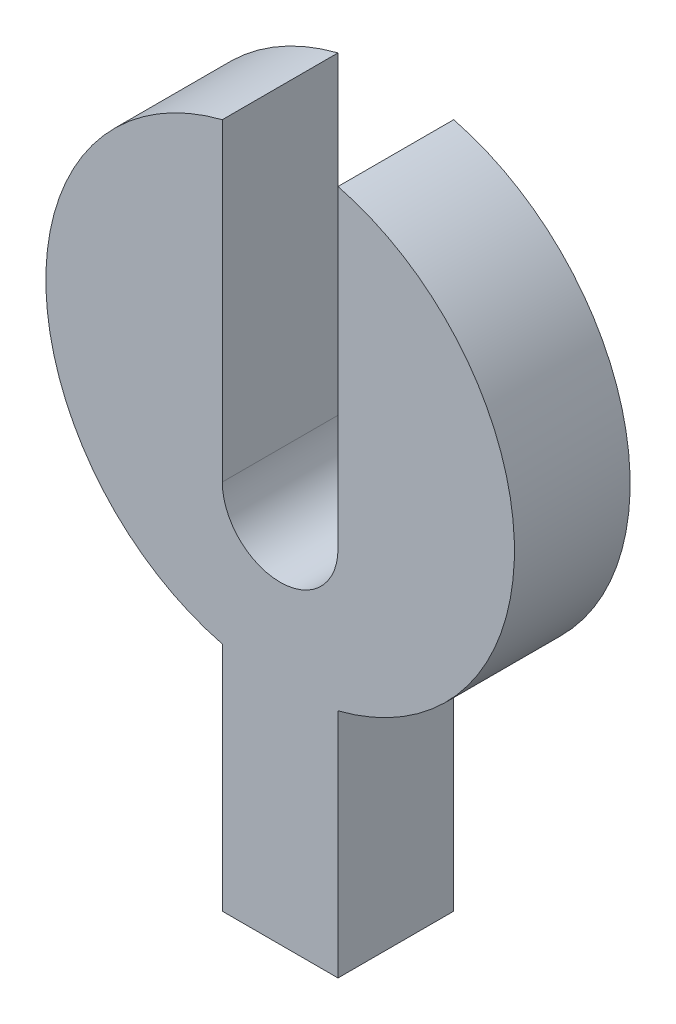
ISO-10303-21;
HEADER;
FILE_DESCRIPTION(('STEP AP214'),'2;1');
FILE_NAME('part.step','',(''),(''),'','','');
FILE_SCHEMA(('AUTOMOTIVE_DESIGN { 1 0 10303 214 1 1 1 1 }'));
ENDSEC;
DATA;
#1=APPLICATION_CONTEXT('core data for automotive mechanical design processes');
#2=APPLICATION_PROTOCOL_DEFINITION('international standard','automotive_design',2000,#1);
#3=PRODUCT_CONTEXT('',#1,'mechanical');
#4=PRODUCT('Part','Part','',(#3));
#5=PRODUCT_RELATED_PRODUCT_CATEGORY('part','',(#4));
#6=PRODUCT_DEFINITION_FORMATION('','',#4);
#7=PRODUCT_DEFINITION_CONTEXT('part definition',#1,'design');
#8=PRODUCT_DEFINITION('design','',#6,#7);
#9=PRODUCT_DEFINITION_SHAPE('','',#8);
#10=(LENGTH_UNIT() NAMED_UNIT(*) SI_UNIT(.MILLI.,.METRE.));
#11=(NAMED_UNIT(*) PLANE_ANGLE_UNIT() SI_UNIT($,.RADIAN.));
#12=(NAMED_UNIT(*) SI_UNIT($,.STERADIAN.) SOLID_ANGLE_UNIT());
#13=UNCERTAINTY_MEASURE_WITH_UNIT(LENGTH_MEASURE(1.E-05),#10,'distance_accuracy_value','');
#14=(GEOMETRIC_REPRESENTATION_CONTEXT(3) GLOBAL_UNCERTAINTY_ASSIGNED_CONTEXT((#13)) GLOBAL_UNIT_ASSIGNED_CONTEXT((#10,
#11,#12)) REPRESENTATION_CONTEXT('',''));
#15=CARTESIAN_POINT('',(0.,0.,0.));
#16=DIRECTION('',(0.,0.,1.));
#17=DIRECTION('',(1.,0.,0.));
#18=AXIS2_PLACEMENT_3D('',#15,#16,#17);
#19=CARTESIAN_POINT('',(0.,-3.,4.));
#20=DIRECTION('',(0.,0.,-1.));
#21=DIRECTION('',(-1.,0.,0.));
#22=AXIS2_PLACEMENT_3D('',#19,#20,#21);
#23=CYLINDRICAL_SURFACE('',#22,2.);
#24=CARTESIAN_POINT('',(0.,-3.,0.));
#25=DIRECTION('',(0.,0.,1.));
#26=DIRECTION('',(1.,0.,0.));
#27=AXIS2_PLACEMENT_3D('',#24,#25,#26);
#28=CIRCLE('',#27,2.);
#29=CARTESIAN_POINT('',(-2.,-3.,0.));
#30=VERTEX_POINT('',#29);
#31=CARTESIAN_POINT('',(2.,-3.,0.));
#32=VERTEX_POINT('',#31);
#33=EDGE_CURVE('E166',#30,#32,#28,.T.);
#34=ORIENTED_EDGE('',*,*,#33,.F.);
#35=DIRECTION('',(0.,0.,-1.));
#36=VECTOR('',#35,1.);
#37=CARTESIAN_POINT('',(-2.,-3.,4.));
#38=LINE('',#37,#36);
#39=CARTESIAN_POINT('',(-2.,-3.,4.));
#40=VERTEX_POINT('',#39);
#41=EDGE_CURVE('E11',#40,#30,#38,.T.);
#42=ORIENTED_EDGE('',*,*,#41,.F.);
#43=CARTESIAN_POINT('',(0.,-3.,4.));
#44=DIRECTION('',(0.,0.,1.));
#45=DIRECTION('',(1.,0.,0.));
#46=AXIS2_PLACEMENT_3D('',#43,#44,#45);
#47=CIRCLE('',#46,2.);
#48=CARTESIAN_POINT('',(2.,-3.,4.));
#49=VERTEX_POINT('',#48);
#50=EDGE_CURVE('E138',#40,#49,#47,.T.);
#51=ORIENTED_EDGE('',*,*,#50,.T.);
#52=DIRECTION('',(0.,0.,-1.));
#53=VECTOR('',#52,1.);
#54=CARTESIAN_POINT('',(2.,-3.,4.));
#55=LINE('',#54,#53);
#56=EDGE_CURVE('E89',#49,#32,#55,.T.);
#57=ORIENTED_EDGE('',*,*,#56,.T.);
#58=EDGE_LOOP('',(#34,#42,#51,#57));
#59=FACE_BOUND('',#58,.T.);
#60=ADVANCED_FACE('F39',(#59),#23,.F.);
#61=CARTESIAN_POINT('',(-2.,0.,4.));
#62=DIRECTION('',(1.,0.,0.));
#63=DIRECTION('',(0.,1.,0.));
#64=AXIS2_PLACEMENT_3D('',#61,#62,#63);
#65=PLANE('',#64);
#66=DIRECTION('',(0.,-1.,0.));
#67=VECTOR('',#66,1.);
#68=CARTESIAN_POINT('',(-2.,0.,0.));
#69=LINE('',#68,#67);
#70=CARTESIAN_POINT('',(-2.,7.84920378127616,0.));
#71=VERTEX_POINT('',#70);
#72=EDGE_CURVE('E163',#71,#30,#69,.T.);
#73=ORIENTED_EDGE('',*,*,#72,.F.);
#74=DIRECTION('',(0.,0.,-1.));
#75=VECTOR('',#74,1.);
#76=CARTESIAN_POINT('',(-2.,7.84920378127616,4.));
#77=LINE('',#76,#75);
#78=CARTESIAN_POINT('',(-2.,7.84920378127616,4.));
#79=VERTEX_POINT('',#78);
#80=EDGE_CURVE('E47',#79,#71,#77,.T.);
#81=ORIENTED_EDGE('',*,*,#80,.F.);
#82=DIRECTION('',(0.,-1.,0.));
#83=VECTOR('',#82,1.);
#84=CARTESIAN_POINT('',(-2.,0.,4.));
#85=LINE('',#84,#83);
#86=EDGE_CURVE('E134',#79,#40,#85,.T.);
#87=ORIENTED_EDGE('',*,*,#86,.T.);
#88=ORIENTED_EDGE('',*,*,#41,.T.);
#89=EDGE_LOOP('',(#73,#81,#87,#88));
#90=FACE_BOUND('',#89,.T.);
#91=ADVANCED_FACE('F164',(#90),#65,.T.);
#92=CARTESIAN_POINT('',(0.,0.,4.));
#93=DIRECTION('',(0.,0.,-1.));
#94=DIRECTION('',(-1.,0.,0.));
#95=AXIS2_PLACEMENT_3D('',#92,#93,#94);
#96=CYLINDRICAL_SURFACE('',#95,8.1);
#97=CARTESIAN_POINT('',(0.,0.,0.));
#98=DIRECTION('',(0.,0.,1.));
#99=DIRECTION('',(1.,0.,0.));
#100=AXIS2_PLACEMENT_3D('',#97,#98,#99);
#101=CIRCLE('',#100,8.1);
#102=CARTESIAN_POINT('',(-2.,-7.84920378127616,0.));
#103=VERTEX_POINT('',#102);
#104=EDGE_CURVE('E147',#103,#71,#101,.F.);
#105=ORIENTED_EDGE('',*,*,#104,.F.);
#106=DIRECTION('',(0.,0.,-1.));
#107=VECTOR('',#106,1.);
#108=CARTESIAN_POINT('',(-2.,-7.84920378127616,4.));
#109=LINE('',#108,#107);
#110=CARTESIAN_POINT('',(-2.,-7.84920378127616,4.));
#111=VERTEX_POINT('',#110);
#112=EDGE_CURVE('E157',#111,#103,#109,.T.);
#113=ORIENTED_EDGE('',*,*,#112,.F.);
#114=CARTESIAN_POINT('',(0.,0.,4.));
#115=DIRECTION('',(0.,0.,1.));
#116=DIRECTION('',(1.,0.,0.));
#117=AXIS2_PLACEMENT_3D('',#114,#115,#116);
#118=CIRCLE('',#117,8.1);
#119=EDGE_CURVE('E128',#111,#79,#118,.F.);
#120=ORIENTED_EDGE('',*,*,#119,.T.);
#121=ORIENTED_EDGE('',*,*,#80,.T.);
#122=EDGE_LOOP('',(#105,#113,#120,#121));
#123=FACE_BOUND('',#122,.T.);
#124=ADVANCED_FACE('F160',(#123),#96,.T.);
#125=CARTESIAN_POINT('',(-2.,0.,4.));
#126=DIRECTION('',(1.,0.,0.));
#127=DIRECTION('',(0.,1.,0.));
#128=AXIS2_PLACEMENT_3D('',#125,#126,#127);
#129=PLANE('',#128);
#130=DIRECTION('',(0.,-1.,0.));
#131=VECTOR('',#130,1.);
#132=CARTESIAN_POINT('',(-2.,0.,0.));
#133=LINE('',#132,#131);
#134=CARTESIAN_POINT('',(-2.,-15.8492037812762,0.));
#135=VERTEX_POINT('',#134);
#136=EDGE_CURVE('E171',#103,#135,#133,.T.);
#137=ORIENTED_EDGE('',*,*,#136,.T.);
#138=DIRECTION('',(0.,0.,-1.));
#139=VECTOR('',#138,1.);
#140=CARTESIAN_POINT('',(-2.,-15.8492037812762,4.));
#141=LINE('',#140,#139);
#142=CARTESIAN_POINT('',(-2.,-15.8492037812762,4.));
#143=VERTEX_POINT('',#142);
#144=EDGE_CURVE('E154',#143,#135,#141,.T.);
#145=ORIENTED_EDGE('',*,*,#144,.F.);
#146=DIRECTION('',(0.,-1.,0.));
#147=VECTOR('',#146,1.);
#148=CARTESIAN_POINT('',(-2.,0.,4.));
#149=LINE('',#148,#147);
#150=EDGE_CURVE('E133',#111,#143,#149,.T.);
#151=ORIENTED_EDGE('',*,*,#150,.F.);
#152=ORIENTED_EDGE('',*,*,#112,.T.);
#153=EDGE_LOOP('',(#137,#145,#151,#152));
#154=FACE_BOUND('',#153,.T.);
#155=ADVANCED_FACE('F185',(#154),#129,.F.);
#156=CARTESIAN_POINT('',(0.,-15.8492037812762,4.));
#157=DIRECTION('',(0.,1.,0.));
#158=DIRECTION('',(0.,0.,1.));
#159=AXIS2_PLACEMENT_3D('',#156,#157,#158);
#160=PLANE('',#159);
#161=DIRECTION('',(1.,0.,0.));
#162=VECTOR('',#161,1.);
#163=CARTESIAN_POINT('',(0.,-15.8492037812762,0.));
#164=LINE('',#163,#162);
#165=CARTESIAN_POINT('',(2.,-15.8492037812762,0.));
#166=VERTEX_POINT('',#165);
#167=EDGE_CURVE('E172',#135,#166,#164,.T.);
#168=ORIENTED_EDGE('',*,*,#167,.T.);
#169=DIRECTION('',(0.,0.,-1.));
#170=VECTOR('',#169,1.);
#171=CARTESIAN_POINT('',(2.,-15.8492037812762,4.));
#172=LINE('',#171,#170);
#173=CARTESIAN_POINT('',(2.,-15.8492037812762,4.));
#174=VERTEX_POINT('',#173);
#175=EDGE_CURVE('E118',#174,#166,#172,.T.);
#176=ORIENTED_EDGE('',*,*,#175,.F.);
#177=DIRECTION('',(1.,0.,0.));
#178=VECTOR('',#177,1.);
#179=CARTESIAN_POINT('',(0.,-15.8492037812762,4.));
#180=LINE('',#179,#178);
#181=EDGE_CURVE('E123',#143,#174,#180,.T.);
#182=ORIENTED_EDGE('',*,*,#181,.F.);
#183=ORIENTED_EDGE('',*,*,#144,.T.);
#184=EDGE_LOOP('',(#168,#176,#182,#183));
#185=FACE_BOUND('',#184,.T.);
#186=ADVANCED_FACE('F190',(#185),#160,.F.);
#187=CARTESIAN_POINT('',(2.,0.,4.));
#188=DIRECTION('',(1.,0.,0.));
#189=DIRECTION('',(0.,1.,0.));
#190=AXIS2_PLACEMENT_3D('',#187,#188,#189);
#191=PLANE('',#190);
#192=DIRECTION('',(0.,-1.,0.));
#193=VECTOR('',#192,1.);
#194=CARTESIAN_POINT('',(2.,0.,0.));
#195=LINE('',#194,#193);
#196=CARTESIAN_POINT('',(2.,-7.84920378127616,0.));
#197=VERTEX_POINT('',#196);
#198=EDGE_CURVE('E113',#197,#166,#195,.T.);
#199=ORIENTED_EDGE('',*,*,#198,.F.);
#200=DIRECTION('',(0.,0.,-1.));
#201=VECTOR('',#200,1.);
#202=CARTESIAN_POINT('',(2.,-7.84920378127616,4.));
#203=LINE('',#202,#201);
#204=CARTESIAN_POINT('',(2.,-7.84920378127616,4.));
#205=VERTEX_POINT('',#204);
#206=EDGE_CURVE('E108',#205,#197,#203,.T.);
#207=ORIENTED_EDGE('',*,*,#206,.F.);
#208=DIRECTION('',(0.,-1.,0.));
#209=VECTOR('',#208,1.);
#210=CARTESIAN_POINT('',(2.,0.,4.));
#211=LINE('',#210,#209);
#212=EDGE_CURVE('E111',#205,#174,#211,.T.);
#213=ORIENTED_EDGE('',*,*,#212,.T.);
#214=ORIENTED_EDGE('',*,*,#175,.T.);
#215=EDGE_LOOP('',(#199,#207,#213,#214));
#216=FACE_BOUND('',#215,.T.);
#217=ADVANCED_FACE('F110',(#216),#191,.T.);
#218=CARTESIAN_POINT('',(2.,7.84920378127616,0.));
#219=VERTEX_POINT('',#218);
#220=EDGE_CURVE('E143',#219,#197,#101,.F.);
#221=ORIENTED_EDGE('',*,*,#220,.F.);
#222=DIRECTION('',(0.,0.,-1.));
#223=VECTOR('',#222,1.);
#224=CARTESIAN_POINT('',(2.,7.84920378127616,4.));
#225=LINE('',#224,#223);
#226=CARTESIAN_POINT('',(2.,7.84920378127616,4.));
#227=VERTEX_POINT('',#226);
#228=EDGE_CURVE('E82',#227,#219,#225,.T.);
#229=ORIENTED_EDGE('',*,*,#228,.F.);
#230=EDGE_CURVE('E121',#227,#205,#118,.F.);
#231=ORIENTED_EDGE('',*,*,#230,.T.);
#232=ORIENTED_EDGE('',*,*,#206,.T.);
#233=EDGE_LOOP('',(#221,#229,#231,#232));
#234=FACE_BOUND('',#233,.T.);
#235=ADVANCED_FACE('F126',(#234),#96,.T.);
#236=CARTESIAN_POINT('',(2.,0.,4.));
#237=DIRECTION('',(1.,0.,0.));
#238=DIRECTION('',(0.,1.,0.));
#239=AXIS2_PLACEMENT_3D('',#236,#237,#238);
#240=PLANE('',#239);
#241=DIRECTION('',(0.,-1.,0.));
#242=VECTOR('',#241,1.);
#243=CARTESIAN_POINT('',(2.,0.,0.));
#244=LINE('',#243,#242);
#245=EDGE_CURVE('E141',#219,#32,#244,.T.);
#246=ORIENTED_EDGE('',*,*,#245,.T.);
#247=ORIENTED_EDGE('',*,*,#56,.F.);
#248=DIRECTION('',(0.,-1.,0.));
#249=VECTOR('',#248,1.);
#250=CARTESIAN_POINT('',(2.,0.,4.));
#251=LINE('',#250,#249);
#252=EDGE_CURVE('E55',#227,#49,#251,.T.);
#253=ORIENTED_EDGE('',*,*,#252,.F.);
#254=ORIENTED_EDGE('',*,*,#228,.T.);
#255=EDGE_LOOP('',(#246,#247,#253,#254));
#256=FACE_BOUND('',#255,.T.);
#257=ADVANCED_FACE('F197',(#256),#240,.F.);
#258=CARTESIAN_POINT('',(0.,0.,4.));
#259=DIRECTION('',(0.,0.,1.));
#260=DIRECTION('',(1.,0.,0.));
#261=AXIS2_PLACEMENT_3D('',#258,#259,#260);
#262=PLANE('',#261);
#263=ORIENTED_EDGE('',*,*,#50,.F.);
#264=ORIENTED_EDGE('',*,*,#86,.F.);
#265=ORIENTED_EDGE('',*,*,#119,.F.);
#266=ORIENTED_EDGE('',*,*,#150,.T.);
#267=ORIENTED_EDGE('',*,*,#181,.T.);
#268=ORIENTED_EDGE('',*,*,#212,.F.);
#269=ORIENTED_EDGE('',*,*,#230,.F.);
#270=ORIENTED_EDGE('',*,*,#252,.T.);
#271=EDGE_LOOP('',(#263,#264,#265,#266,#267,#268,#269,#270));
#272=FACE_BOUND('',#271,.T.);
#273=ADVANCED_FACE('F120',(#272),#262,.T.);
#274=CARTESIAN_POINT('',(0.,0.,0.));
#275=DIRECTION('',(0.,0.,1.));
#276=DIRECTION('',(1.,0.,0.));
#277=AXIS2_PLACEMENT_3D('',#274,#275,#276);
#278=PLANE('',#277);
#279=ORIENTED_EDGE('',*,*,#33,.T.);
#280=ORIENTED_EDGE('',*,*,#245,.F.);
#281=ORIENTED_EDGE('',*,*,#220,.T.);
#282=ORIENTED_EDGE('',*,*,#198,.T.);
#283=ORIENTED_EDGE('',*,*,#167,.F.);
#284=ORIENTED_EDGE('',*,*,#136,.F.);
#285=ORIENTED_EDGE('',*,*,#104,.T.);
#286=ORIENTED_EDGE('',*,*,#72,.T.);
#287=EDGE_LOOP('',(#279,#280,#281,#282,#283,#284,#285,#286));
#288=FACE_BOUND('',#287,.T.);
#289=ADVANCED_FACE('F169',(#288),#278,.F.);
#290=CLOSED_SHELL('',(#60,#91,#124,#155,#186,#217,#235,#257,#273,#289));
#291=MANIFOLD_SOLID_BREP('B2',#290);
#292=ADVANCED_BREP_SHAPE_REPRESENTATION('',(#18,#291),#14);
#293=SHAPE_DEFINITION_REPRESENTATION(#9,#292);
ENDSEC;
END-ISO-10303-21;
